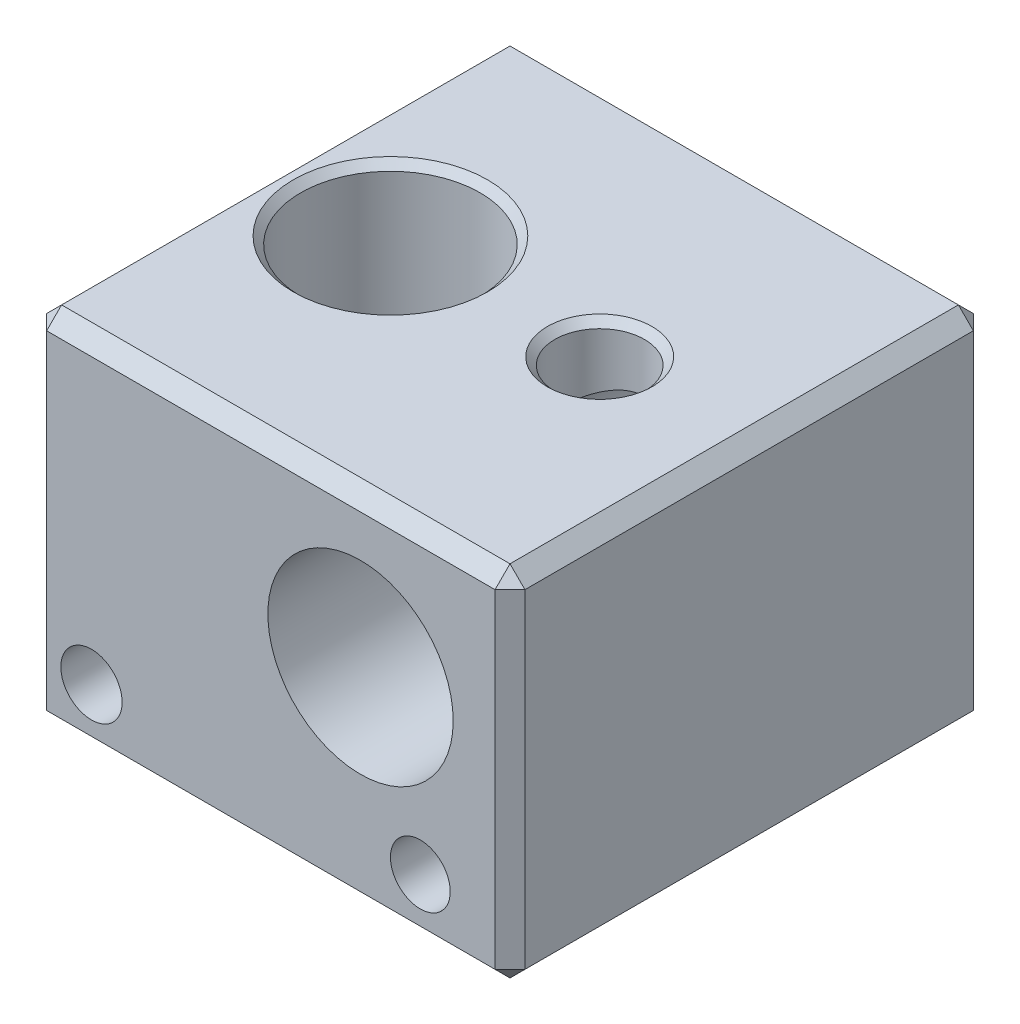
ISO-10303-21;
HEADER;
FILE_DESCRIPTION(('STEP AP214'),'2;1');
FILE_NAME('part.step','',(''),(''),'','','');
FILE_SCHEMA(('AUTOMOTIVE_DESIGN { 1 0 10303 214 1 1 1 1 }'));
ENDSEC;
DATA;
#1=APPLICATION_CONTEXT('core data for automotive mechanical design processes');
#2=APPLICATION_PROTOCOL_DEFINITION('international standard','automotive_design',2000,#1);
#3=PRODUCT_CONTEXT('',#1,'mechanical');
#4=PRODUCT('Part','Part','',(#3));
#5=PRODUCT_RELATED_PRODUCT_CATEGORY('part','',(#4));
#6=PRODUCT_DEFINITION_FORMATION('','',#4);
#7=PRODUCT_DEFINITION_CONTEXT('part definition',#1,'design');
#8=PRODUCT_DEFINITION('design','',#6,#7);
#9=PRODUCT_DEFINITION_SHAPE('','',#8);
#10=(LENGTH_UNIT() NAMED_UNIT(*) SI_UNIT(.MILLI.,.METRE.));
#11=(NAMED_UNIT(*) PLANE_ANGLE_UNIT() SI_UNIT($,.RADIAN.));
#12=(NAMED_UNIT(*) SI_UNIT($,.STERADIAN.) SOLID_ANGLE_UNIT());
#13=UNCERTAINTY_MEASURE_WITH_UNIT(LENGTH_MEASURE(1.E-05),#10,'distance_accuracy_value','');
#14=(GEOMETRIC_REPRESENTATION_CONTEXT(3) GLOBAL_UNCERTAINTY_ASSIGNED_CONTEXT((#13)) GLOBAL_UNIT_ASSIGNED_CONTEXT((#10,
#11,#12)) REPRESENTATION_CONTEXT('',''));
#15=CARTESIAN_POINT('',(0.,0.,0.));
#16=DIRECTION('',(0.,0.,1.));
#17=DIRECTION('',(1.,0.,0.));
#18=AXIS2_PLACEMENT_3D('',#15,#16,#17);
#19=CARTESIAN_POINT('',(8.,6.,0.));
#20=DIRECTION('',(1.,0.,0.));
#21=DIRECTION('',(0.,0.,-1.));
#22=AXIS2_PLACEMENT_3D('',#19,#20,#21);
#23=PLANE('',#22);
#24=DIRECTION('',(0.,0.,-1.));
#25=VECTOR('',#24,1.);
#26=CARTESIAN_POINT('',(8.,-5.5,-8.));
#27=LINE('',#26,#25);
#28=CARTESIAN_POINT('',(8.,-5.5,7.5));
#29=VERTEX_POINT('',#28);
#30=CARTESIAN_POINT('',(8.,-5.5,-7.5));
#31=VERTEX_POINT('',#30);
#32=EDGE_CURVE('E369',#29,#31,#27,.T.);
#33=ORIENTED_EDGE('',*,*,#32,.T.);
#34=DIRECTION('',(0.,1.,0.));
#35=VECTOR('',#34,1.);
#36=CARTESIAN_POINT('',(8.,6.,-7.5));
#37=LINE('',#36,#35);
#38=CARTESIAN_POINT('',(8.,5.5,-7.5));
#39=VERTEX_POINT('',#38);
#40=EDGE_CURVE('E367',#31,#39,#37,.T.);
#41=ORIENTED_EDGE('',*,*,#40,.T.);
#42=DIRECTION('',(0.,0.,1.));
#43=VECTOR('',#42,1.);
#44=CARTESIAN_POINT('',(8.,5.5,0.));
#45=LINE('',#44,#43);
#46=CARTESIAN_POINT('',(8.,5.5,7.5));
#47=VERTEX_POINT('',#46);
#48=EDGE_CURVE('E371',#39,#47,#45,.T.);
#49=ORIENTED_EDGE('',*,*,#48,.T.);
#50=DIRECTION('',(0.,-1.,0.));
#51=VECTOR('',#50,1.);
#52=CARTESIAN_POINT('',(8.,-6.,7.5));
#53=LINE('',#52,#51);
#54=EDGE_CURVE('E373',#47,#29,#53,.T.);
#55=ORIENTED_EDGE('',*,*,#54,.T.);
#56=EDGE_LOOP('',(#33,#41,#49,#55));
#57=FACE_BOUND('',#56,.T.);
#58=ADVANCED_FACE('F34',(#57),#23,.T.);
#59=CARTESIAN_POINT('',(0.,6.,-8.));
#60=DIRECTION('',(0.,0.,-1.));
#61=DIRECTION('',(-1.,0.,0.));
#62=AXIS2_PLACEMENT_3D('',#59,#60,#61);
#63=PLANE('',#62);
#64=DIRECTION('',(0.,-1.,0.));
#65=VECTOR('',#64,1.);
#66=CARTESIAN_POINT('',(7.5,6.,-8.));
#67=LINE('',#66,#65);
#68=CARTESIAN_POINT('',(7.5,5.5,-8.));
#69=VERTEX_POINT('',#68);
#70=CARTESIAN_POINT('',(7.5,-5.5,-8.));
#71=VERTEX_POINT('',#70);
#72=EDGE_CURVE('E396',#69,#71,#67,.T.);
#73=ORIENTED_EDGE('',*,*,#72,.T.);
#74=DIRECTION('',(-1.,0.,0.));
#75=VECTOR('',#74,1.);
#76=CARTESIAN_POINT('',(-8.,-5.5,-8.));
#77=LINE('',#76,#75);
#78=CARTESIAN_POINT('',(-7.5,-5.5,-8.));
#79=VERTEX_POINT('',#78);
#80=EDGE_CURVE('E393',#71,#79,#77,.T.);
#81=ORIENTED_EDGE('',*,*,#80,.T.);
#82=DIRECTION('',(0.,1.,0.));
#83=VECTOR('',#82,1.);
#84=CARTESIAN_POINT('',(-7.5,6.,-8.));
#85=LINE('',#84,#83);
#86=CARTESIAN_POINT('',(-7.5,5.5,-8.));
#87=VERTEX_POINT('',#86);
#88=EDGE_CURVE('E400',#79,#87,#85,.T.);
#89=ORIENTED_EDGE('',*,*,#88,.T.);
#90=DIRECTION('',(1.,0.,0.));
#91=VECTOR('',#90,1.);
#92=CARTESIAN_POINT('',(0.,5.5,-8.));
#93=LINE('',#92,#91);
#94=EDGE_CURVE('E398',#87,#69,#93,.T.);
#95=ORIENTED_EDGE('',*,*,#94,.T.);
#96=EDGE_LOOP('',(#73,#81,#89,#95));
#97=FACE_BOUND('',#96,.T.);
#98=CARTESIAN_POINT('',(5.,-4.,-8.));
#99=DIRECTION('',(0.,0.,1.));
#100=DIRECTION('',(1.,0.,0.));
#101=AXIS2_PLACEMENT_3D('',#98,#99,#100);
#102=CIRCLE('',#101,1.);
#103=CARTESIAN_POINT('',(6.,-4.,-8.));
#104=VERTEX_POINT('',#103);
#105=EDGE_CURVE('E681',#104,#104,#102,.T.);
#106=ORIENTED_EDGE('',*,*,#105,.T.);
#107=EDGE_LOOP('',(#106));
#108=FACE_BOUND('',#107,.T.);
#109=CARTESIAN_POINT('',(3.,1.,-8.));
#110=DIRECTION('',(0.,0.,1.));
#111=DIRECTION('',(1.,0.,0.));
#112=AXIS2_PLACEMENT_3D('',#109,#110,#111);
#113=CIRCLE('',#112,3.1);
#114=CARTESIAN_POINT('',(6.1,1.,-8.));
#115=VERTEX_POINT('',#114);
#116=EDGE_CURVE('E143',#115,#115,#113,.T.);
#117=ORIENTED_EDGE('',*,*,#116,.T.);
#118=EDGE_LOOP('',(#117));
#119=FACE_BOUND('',#118,.T.);
#120=ADVANCED_FACE('F175',(#97,#108,#119),#63,.T.);
#121=CARTESIAN_POINT('',(-8.,6.,0.));
#122=DIRECTION('',(1.,0.,0.));
#123=DIRECTION('',(0.,0.,-1.));
#124=AXIS2_PLACEMENT_3D('',#121,#122,#123);
#125=PLANE('',#124);
#126=DIRECTION('',(0.,-1.,0.));
#127=VECTOR('',#126,1.);
#128=CARTESIAN_POINT('',(-8.,-6.,-7.5));
#129=LINE('',#128,#127);
#130=CARTESIAN_POINT('',(-8.,5.5,-7.5));
#131=VERTEX_POINT('',#130);
#132=CARTESIAN_POINT('',(-8.,-5.5,-7.5));
#133=VERTEX_POINT('',#132);
#134=EDGE_CURVE('E387',#131,#133,#129,.T.);
#135=ORIENTED_EDGE('',*,*,#134,.T.);
#136=DIRECTION('',(0.,0.,1.));
#137=VECTOR('',#136,1.);
#138=CARTESIAN_POINT('',(-8.,-5.5,0.));
#139=LINE('',#138,#137);
#140=CARTESIAN_POINT('',(-8.,-5.5,7.5));
#141=VERTEX_POINT('',#140);
#142=EDGE_CURVE('E384',#133,#141,#139,.T.);
#143=ORIENTED_EDGE('',*,*,#142,.T.);
#144=DIRECTION('',(0.,1.,0.));
#145=VECTOR('',#144,1.);
#146=CARTESIAN_POINT('',(-8.,6.,7.5));
#147=LINE('',#146,#145);
#148=CARTESIAN_POINT('',(-8.,5.5,7.5));
#149=VERTEX_POINT('',#148);
#150=EDGE_CURVE('E391',#141,#149,#147,.T.);
#151=ORIENTED_EDGE('',*,*,#150,.T.);
#152=DIRECTION('',(0.,0.,-1.));
#153=VECTOR('',#152,1.);
#154=CARTESIAN_POINT('',(-8.,5.5,-8.));
#155=LINE('',#154,#153);
#156=EDGE_CURVE('E389',#149,#131,#155,.T.);
#157=ORIENTED_EDGE('',*,*,#156,.T.);
#158=EDGE_LOOP('',(#135,#143,#151,#157));
#159=FACE_BOUND('',#158,.T.);
#160=ADVANCED_FACE('F181',(#159),#125,.F.);
#161=CARTESIAN_POINT('',(-4.,6.,0.));
#162=DIRECTION('',(0.,-1.,0.));
#163=DIRECTION('',(0.,0.,-1.));
#164=AXIS2_PLACEMENT_3D('',#161,#162,#163);
#165=CYLINDRICAL_SURFACE('',#164,3.);
#166=CARTESIAN_POINT('',(-4.,-5.75,0.));
#167=DIRECTION('',(0.,1.,0.));
#168=DIRECTION('',(0.,0.,1.));
#169=AXIS2_PLACEMENT_3D('',#166,#167,#168);
#170=CIRCLE('',#169,3.);
#171=CARTESIAN_POINT('',(-4.,-5.75,3.));
#172=VERTEX_POINT('',#171);
#173=EDGE_CURVE('E285',#172,#172,#170,.F.);
#174=ORIENTED_EDGE('',*,*,#173,.T.);
#175=EDGE_LOOP('',(#174));
#176=FACE_BOUND('',#175,.T.);
#177=CARTESIAN_POINT('',(-4.,5.74999999999999,0.));
#178=DIRECTION('',(0.,1.,0.));
#179=DIRECTION('',(0.,0.,1.));
#180=AXIS2_PLACEMENT_3D('',#177,#178,#179);
#181=CIRCLE('',#180,3.);
#182=CARTESIAN_POINT('',(-4.,5.74999999999999,3.));
#183=VERTEX_POINT('',#182);
#184=EDGE_CURVE('E289',#183,#183,#181,.T.);
#185=ORIENTED_EDGE('',*,*,#184,.T.);
#186=EDGE_LOOP('',(#185));
#187=FACE_BOUND('',#186,.T.);
#188=ADVANCED_FACE('F187',(#176,#187),#165,.F.);
#189=CARTESIAN_POINT('',(0.,6.,8.));
#190=DIRECTION('',(0.,0.,-1.));
#191=DIRECTION('',(-1.,0.,0.));
#192=AXIS2_PLACEMENT_3D('',#189,#190,#191);
#193=PLANE('',#192);
#194=DIRECTION('',(0.,-1.,0.));
#195=VECTOR('',#194,1.);
#196=CARTESIAN_POINT('',(-7.5,6.,8.));
#197=LINE('',#196,#195);
#198=CARTESIAN_POINT('',(-7.5,5.5,8.));
#199=VERTEX_POINT('',#198);
#200=CARTESIAN_POINT('',(-7.5,-5.5,8.));
#201=VERTEX_POINT('',#200);
#202=EDGE_CURVE('E382',#199,#201,#197,.T.);
#203=ORIENTED_EDGE('',*,*,#202,.T.);
#204=DIRECTION('',(1.,0.,0.));
#205=VECTOR('',#204,1.);
#206=CARTESIAN_POINT('',(0.,-5.5,8.));
#207=LINE('',#206,#205);
#208=CARTESIAN_POINT('',(7.5,-5.5,8.));
#209=VERTEX_POINT('',#208);
#210=EDGE_CURVE('E375',#201,#209,#207,.T.);
#211=ORIENTED_EDGE('',*,*,#210,.T.);
#212=DIRECTION('',(0.,1.,0.));
#213=VECTOR('',#212,1.);
#214=CARTESIAN_POINT('',(7.5,6.,8.));
#215=LINE('',#214,#213);
#216=CARTESIAN_POINT('',(7.5,5.5,8.));
#217=VERTEX_POINT('',#216);
#218=EDGE_CURVE('E378',#209,#217,#215,.T.);
#219=ORIENTED_EDGE('',*,*,#218,.T.);
#220=DIRECTION('',(-1.,0.,0.));
#221=VECTOR('',#220,1.);
#222=CARTESIAN_POINT('',(-8.,5.5,8.));
#223=LINE('',#222,#221);
#224=EDGE_CURVE('E380',#217,#199,#223,.T.);
#225=ORIENTED_EDGE('',*,*,#224,.T.);
#226=EDGE_LOOP('',(#203,#211,#219,#225));
#227=FACE_BOUND('',#226,.T.);
#228=CARTESIAN_POINT('',(5.,-4.,8.));
#229=DIRECTION('',(0.,0.,1.));
#230=DIRECTION('',(1.,0.,0.));
#231=AXIS2_PLACEMENT_3D('',#228,#229,#230);
#232=CIRCLE('',#231,1.);
#233=CARTESIAN_POINT('',(6.,-4.,8.));
#234=VERTEX_POINT('',#233);
#235=EDGE_CURVE('E153',#234,#234,#232,.T.);
#236=ORIENTED_EDGE('',*,*,#235,.F.);
#237=EDGE_LOOP('',(#236));
#238=FACE_BOUND('',#237,.T.);
#239=CARTESIAN_POINT('',(3.,1.,8.));
#240=DIRECTION('',(0.,0.,1.));
#241=DIRECTION('',(1.,0.,0.));
#242=AXIS2_PLACEMENT_3D('',#239,#240,#241);
#243=CIRCLE('',#242,3.1);
#244=CARTESIAN_POINT('',(6.1,1.,8.));
#245=VERTEX_POINT('',#244);
#246=EDGE_CURVE('E685',#245,#245,#243,.T.);
#247=ORIENTED_EDGE('',*,*,#246,.F.);
#248=EDGE_LOOP('',(#247));
#249=FACE_BOUND('',#248,.T.);
#250=CARTESIAN_POINT('',(-6.,-4.,8.));
#251=DIRECTION('',(0.,0.,1.));
#252=DIRECTION('',(1.,0.,0.));
#253=AXIS2_PLACEMENT_3D('',#250,#251,#252);
#254=CIRCLE('',#253,1.025);
#255=CARTESIAN_POINT('',(-4.975,-4.,8.));
#256=VERTEX_POINT('',#255);
#257=EDGE_CURVE('E138',#256,#256,#254,.T.);
#258=ORIENTED_EDGE('',*,*,#257,.F.);
#259=EDGE_LOOP('',(#258));
#260=FACE_BOUND('',#259,.T.);
#261=ADVANCED_FACE('F190',(#227,#238,#249,#260),#193,.F.);
#262=CARTESIAN_POINT('',(0.,6.,0.));
#263=DIRECTION('',(0.,1.,0.));
#264=DIRECTION('',(0.,0.,1.));
#265=AXIS2_PLACEMENT_3D('',#262,#263,#264);
#266=PLANE('',#265);
#267=CARTESIAN_POINT('',(3.,6.,0.));
#268=DIRECTION('',(0.,1.,0.));
#269=DIRECTION('',(0.,0.,1.));
#270=AXIS2_PLACEMENT_3D('',#267,#268,#269);
#271=CIRCLE('',#270,1.75000000000001);
#272=CARTESIAN_POINT('',(3.,6.,1.75000000000001));
#273=VERTEX_POINT('',#272);
#274=EDGE_CURVE('E11',#273,#273,#271,.F.);
#275=ORIENTED_EDGE('',*,*,#274,.T.);
#276=EDGE_LOOP('',(#275));
#277=FACE_BOUND('',#276,.T.);
#278=CARTESIAN_POINT('',(-4.,6.,0.));
#279=DIRECTION('',(0.,1.,0.));
#280=DIRECTION('',(0.,0.,1.));
#281=AXIS2_PLACEMENT_3D('',#278,#279,#280);
#282=CIRCLE('',#281,3.25000000000001);
#283=CARTESIAN_POINT('',(-4.,6.,3.25000000000001));
#284=VERTEX_POINT('',#283);
#285=EDGE_CURVE('E42',#284,#284,#282,.F.);
#286=ORIENTED_EDGE('',*,*,#285,.T.);
#287=EDGE_LOOP('',(#286));
#288=FACE_BOUND('',#287,.T.);
#289=DIRECTION('',(1.,0.,0.));
#290=VECTOR('',#289,1.);
#291=CARTESIAN_POINT('',(8.,6.,7.5));
#292=LINE('',#291,#290);
#293=CARTESIAN_POINT('',(-7.5,6.,7.5));
#294=VERTEX_POINT('',#293);
#295=CARTESIAN_POINT('',(7.5,6.,7.5));
#296=VERTEX_POINT('',#295);
#297=EDGE_CURVE('E57',#294,#296,#292,.T.);
#298=ORIENTED_EDGE('',*,*,#297,.T.);
#299=DIRECTION('',(0.,0.,-1.));
#300=VECTOR('',#299,1.);
#301=CARTESIAN_POINT('',(7.5,6.,0.));
#302=LINE('',#301,#300);
#303=CARTESIAN_POINT('',(7.5,6.,-7.5));
#304=VERTEX_POINT('',#303);
#305=EDGE_CURVE('E297',#296,#304,#302,.T.);
#306=ORIENTED_EDGE('',*,*,#305,.T.);
#307=DIRECTION('',(-1.,0.,0.));
#308=VECTOR('',#307,1.);
#309=CARTESIAN_POINT('',(0.,6.,-7.5));
#310=LINE('',#309,#308);
#311=CARTESIAN_POINT('',(-7.5,6.,-7.5));
#312=VERTEX_POINT('',#311);
#313=EDGE_CURVE('E362',#304,#312,#310,.T.);
#314=ORIENTED_EDGE('',*,*,#313,.T.);
#315=DIRECTION('',(0.,0.,1.));
#316=VECTOR('',#315,1.);
#317=CARTESIAN_POINT('',(-7.5,6.,8.));
#318=LINE('',#317,#316);
#319=EDGE_CURVE('E365',#312,#294,#318,.T.);
#320=ORIENTED_EDGE('',*,*,#319,.T.);
#321=EDGE_LOOP('',(#298,#306,#314,#320));
#322=FACE_BOUND('',#321,.T.);
#323=ADVANCED_FACE('F454',(#277,#288,#322),#266,.T.);
#324=CARTESIAN_POINT('',(0.,-6.,0.));
#325=DIRECTION('',(0.,1.,0.));
#326=DIRECTION('',(0.,0.,1.));
#327=AXIS2_PLACEMENT_3D('',#324,#325,#326);
#328=PLANE('',#327);
#329=CARTESIAN_POINT('',(-4.,-6.,0.));
#330=DIRECTION('',(0.,1.,0.));
#331=DIRECTION('',(0.,0.,1.));
#332=AXIS2_PLACEMENT_3D('',#329,#330,#331);
#333=CIRCLE('',#332,3.25);
#334=CARTESIAN_POINT('',(-4.,-6.,3.25));
#335=VERTEX_POINT('',#334);
#336=EDGE_CURVE('E294',#335,#335,#333,.T.);
#337=ORIENTED_EDGE('',*,*,#336,.T.);
#338=EDGE_LOOP('',(#337));
#339=FACE_BOUND('',#338,.T.);
#340=DIRECTION('',(0.,0.,-1.));
#341=VECTOR('',#340,1.);
#342=CARTESIAN_POINT('',(-7.5,-6.,0.));
#343=LINE('',#342,#341);
#344=CARTESIAN_POINT('',(-7.5,-6.,7.5));
#345=VERTEX_POINT('',#344);
#346=CARTESIAN_POINT('',(-7.5,-6.,-7.5));
#347=VERTEX_POINT('',#346);
#348=EDGE_CURVE('E405',#345,#347,#343,.T.);
#349=ORIENTED_EDGE('',*,*,#348,.T.);
#350=DIRECTION('',(1.,0.,0.));
#351=VECTOR('',#350,1.);
#352=CARTESIAN_POINT('',(8.,-6.,-7.5));
#353=LINE('',#352,#351);
#354=CARTESIAN_POINT('',(7.5,-6.,-7.5));
#355=VERTEX_POINT('',#354);
#356=EDGE_CURVE('E402',#347,#355,#353,.T.);
#357=ORIENTED_EDGE('',*,*,#356,.T.);
#358=DIRECTION('',(0.,0.,1.));
#359=VECTOR('',#358,1.);
#360=CARTESIAN_POINT('',(7.5,-6.,8.));
#361=LINE('',#360,#359);
#362=CARTESIAN_POINT('',(7.5,-6.,7.5));
#363=VERTEX_POINT('',#362);
#364=EDGE_CURVE('E137',#355,#363,#361,.T.);
#365=ORIENTED_EDGE('',*,*,#364,.T.);
#366=DIRECTION('',(-1.,0.,0.));
#367=VECTOR('',#366,1.);
#368=CARTESIAN_POINT('',(0.,-6.,7.5));
#369=LINE('',#368,#367);
#370=EDGE_CURVE('E140',#363,#345,#369,.T.);
#371=ORIENTED_EDGE('',*,*,#370,.T.);
#372=EDGE_LOOP('',(#349,#357,#365,#371));
#373=FACE_BOUND('',#372,.T.);
#374=ADVANCED_FACE('F131',(#339,#373),#328,.F.);
#375=CARTESIAN_POINT('',(-6.,-4.,3.5));
#376=DIRECTION('',(0.,0.,1.));
#377=DIRECTION('',(1.,0.,0.));
#378=AXIS2_PLACEMENT_3D('',#375,#376,#377);
#379=CONICAL_SURFACE('',#378,1.025,1.02974425867665);
#380=CARTESIAN_POINT('',(-6.,-4.,2.88411786549675));
#381=VERTEX_POINT('',#380);
#382=VERTEX_LOOP('',#381);
#383=FACE_BOUND('',#382,.T.);
#384=CARTESIAN_POINT('',(-6.,-4.,3.5));
#385=DIRECTION('',(0.,0.,1.));
#386=DIRECTION('',(1.,0.,0.));
#387=AXIS2_PLACEMENT_3D('',#384,#385,#386);
#388=CIRCLE('',#387,1.025);
#389=CARTESIAN_POINT('',(-4.975,-4.,3.5));
#390=VERTEX_POINT('',#389);
#391=EDGE_CURVE('E135',#390,#390,#388,.T.);
#392=ORIENTED_EDGE('',*,*,#391,.T.);
#393=EDGE_LOOP('',(#392));
#394=FACE_BOUND('',#393,.T.);
#395=ADVANCED_FACE('F127',(#383,#394),#379,.F.);
#396=CARTESIAN_POINT('',(-6.,-4.,8.));
#397=DIRECTION('',(0.,0.,1.));
#398=DIRECTION('',(1.,0.,0.));
#399=AXIS2_PLACEMENT_3D('',#396,#397,#398);
#400=CYLINDRICAL_SURFACE('',#399,1.025);
#401=ORIENTED_EDGE('',*,*,#391,.F.);
#402=EDGE_LOOP('',(#401));
#403=FACE_BOUND('',#402,.T.);
#404=ORIENTED_EDGE('',*,*,#257,.T.);
#405=EDGE_LOOP('',(#404));
#406=FACE_BOUND('',#405,.T.);
#407=ADVANCED_FACE('F130',(#403,#406),#400,.F.);
#408=CARTESIAN_POINT('',(3.,1.,-8.));
#409=DIRECTION('',(0.,0.,1.));
#410=DIRECTION('',(1.,0.,0.));
#411=AXIS2_PLACEMENT_3D('',#408,#409,#410);
#412=CYLINDRICAL_SURFACE('',#411,3.1);
#413=CARTESIAN_POINT('',(3.,4.1,1.5));
#414=CARTESIAN_POINT('',(3.07915977181462,4.09999597642038,1.49999529296468));
#415=CARTESIAN_POINT('',(3.15842288075809,4.09693497160373,1.49369683955839));
#416=CARTESIAN_POINT('',(3.31462546467892,4.08499234682663,1.46877262837549));
#417=CARTESIAN_POINT('',(3.39155981896931,4.07609875456068,1.4501215140343));
#418=CARTESIAN_POINT('',(3.54060341094592,4.05342584261601,1.40138191522432));
#419=CARTESIAN_POINT('',(3.61272977492893,4.03966510245178,1.37133689401739));
#420=CARTESIAN_POINT('',(3.75082034873863,4.00853554392298,1.30087774159277));
#421=CARTESIAN_POINT('',(3.8167853053403,3.99116716363645,1.26046486920983));
#422=CARTESIAN_POINT('',(3.94496533625193,3.95326290002702,1.16775554958169));
#423=CARTESIAN_POINT('',(4.00674424015157,3.93260205714617,1.11490784824096));
#424=CARTESIAN_POINT('',(4.12095918636624,3.890874407927,1.00001014953006));
#425=CARTESIAN_POINT('',(4.17338859126746,3.86980732485464,0.937953671458202));
#426=CARTESIAN_POINT('',(4.27116086028914,3.82792833782551,0.8010722476601));
#427=CARTESIAN_POINT('',(4.31573021820139,3.80724210749,0.725651929346729));
#428=CARTESIAN_POINT('',(4.39136353669037,3.77053911674571,0.567268570731539));
#429=CARTESIAN_POINT('',(4.42243666689194,3.75451918839689,0.484310698087358));
#430=CARTESIAN_POINT('',(4.46825331672929,3.73036118668724,0.318147108146287));
#431=CARTESIAN_POINT('',(4.48384017116723,3.721819502993,0.23523541625442));
#432=CARTESIAN_POINT('',(4.50083891652223,3.71248732714977,0.0675694189226937));
#433=CARTESIAN_POINT('',(4.50226328587823,3.71169001152166,-0.0171831984852869));
#434=CARTESIAN_POINT('',(4.49151791991513,3.71760810460528,-0.176097490071581));
#435=CARTESIAN_POINT('',(4.48082916653394,3.72350517814873,-0.250396919578849));
#436=CARTESIAN_POINT('',(4.44871001883635,3.7407239691475,-0.395977710690246));
#437=CARTESIAN_POINT('',(4.4272765472017,3.75204724064055,-0.467258201315278));
#438=CARTESIAN_POINT('',(4.37386819698877,3.77909986285486,-0.606795469604337));
#439=CARTESIAN_POINT('',(4.34165938165877,3.79492571085596,-0.674943125225589));
#440=CARTESIAN_POINT('',(4.26778986270146,3.82919863337539,-0.805183438946943));
#441=CARTESIAN_POINT('',(4.2261249505331,3.84764687364832,-0.867273383348186));
#442=CARTESIAN_POINT('',(4.12879722643253,3.88771489454708,-0.991333088786456));
#443=CARTESIAN_POINT('',(4.0720638451715,3.90945233713627,-1.05242780585103));
#444=CARTESIAN_POINT('',(3.94903700373154,3.95187442060876,-1.16458625824764));
#445=CARTESIAN_POINT('',(3.88273953658797,3.97255861528501,-1.21564576794678));
#446=CARTESIAN_POINT('',(3.73900734209544,4.01158253300309,-1.30822988474855));
#447=CARTESIAN_POINT('',(3.66122781797247,4.02979163503844,-1.34927865517565));
#448=CARTESIAN_POINT('',(3.49876114199507,4.06072768963243,-1.41738461203208));
#449=CARTESIAN_POINT('',(3.41407919768172,4.07345873041227,-1.44445223548274));
#450=CARTESIAN_POINT('',(3.2474068560528,4.09115669145021,-1.48172025888453));
#451=CARTESIAN_POINT('',(3.16573443615837,4.09665865598145,-1.49308672062882));
#452=CARTESIAN_POINT('',(3.00146762178004,4.10108637596971,-1.50225023509642));
#453=CARTESIAN_POINT('',(2.91887363918456,4.10001496041855,-1.50005312518445));
#454=CARTESIAN_POINT('',(2.76137885944981,4.09173711541004,-1.48286405136195));
#455=CARTESIAN_POINT('',(2.68635038714927,4.08497504037063,-1.46879861778274));
#456=CARTESIAN_POINT('',(2.53985552059721,4.0665485679608,-1.42969111021901));
#457=CARTESIAN_POINT('',(2.468389531672,4.05488361417641,-1.40464779037107));
#458=CARTESIAN_POINT('',(2.32860070585063,4.02728476011027,-1.34358303927532));
#459=CARTESIAN_POINT('',(2.26043482976315,4.01123408615672,-1.30725691739171));
#460=CARTESIAN_POINT('',(2.13093151328423,3.97644474324639,-1.22499460309151));
#461=CARTESIAN_POINT('',(2.06959706399895,3.9577049050061,-1.17905422626836));
#462=CARTESIAN_POINT('',(1.94944170578362,3.91731206279293,-1.07390895792714));
#463=CARTESIAN_POINT('',(1.89138869103721,3.89555036660016,-1.01386657095023));
#464=CARTESIAN_POINT('',(1.78586139592846,3.85291315524895,-0.884773164890674));
#465=CARTESIAN_POINT('',(1.73839329578026,3.83203816353815,-0.815716919992923));
#466=CARTESIAN_POINT('',(1.65361920140516,3.79276450107802,-0.666987428868441));
#467=CARTESIAN_POINT('',(1.61679988699864,3.774499545128,-0.58699845137175));
#468=CARTESIAN_POINT('',(1.55753664260151,3.74416205958639,-0.420784263722467));
#469=CARTESIAN_POINT('',(1.53507541318362,3.73208208149401,-0.33456669812492));
#470=CARTESIAN_POINT('',(1.50713753689094,3.71690845900092,-0.166995806053239));
#471=CARTESIAN_POINT('',(1.50026841836273,3.71307979083778,-0.085942091506686));
#472=CARTESIAN_POINT('',(1.49974737267378,3.71279292639793,0.0762081044812507));
#473=CARTESIAN_POINT('',(1.50609081466772,3.71633214776335,0.157304560982426));
#474=CARTESIAN_POINT('',(1.53053493223183,3.72962202886765,0.310089299737686));
#475=CARTESIAN_POINT('',(1.54760389225735,3.73882630078165,0.381995866001077));
#476=CARTESIAN_POINT('',(1.59179669036143,3.76180738740559,0.521868601326146));
#477=CARTESIAN_POINT('',(1.61892362498772,3.77558561016049,0.589833549422497));
#478=CARTESIAN_POINT('',(1.68451657692935,3.80729627577953,0.724924730665312));
#479=CARTESIAN_POINT('',(1.72362146141282,3.82544547690661,0.791688484200769));
#480=CARTESIAN_POINT('',(1.81131972600155,3.86344589570492,0.918131698139951));
#481=CARTESIAN_POINT('',(1.85991783215684,3.8832979583464,0.977807606079314));
#482=CARTESIAN_POINT('',(1.97156375078651,3.92510681717823,1.09525774071261));
#483=CARTESIAN_POINT('',(2.03561672298499,3.9470526292076,1.15208553285705));
#484=CARTESIAN_POINT('',(2.17301649075045,3.98851853466426,1.25436518012467));
#485=CARTESIAN_POINT('',(2.24636793220146,4.00803740577162,1.29981131450963));
#486=CARTESIAN_POINT('',(2.40069933116372,4.04254711231385,1.37779452138669));
#487=CARTESIAN_POINT('',(2.48168317941652,4.05753562176688,1.4103249653733));
#488=CARTESIAN_POINT('',(2.64879510265626,4.08118837139856,1.46089989511797));
#489=CARTESIAN_POINT('',(2.73490741027468,4.08987101250737,1.47898654430786));
#490=CARTESIAN_POINT('',(2.85151084784554,4.09658457518121,1.49293017778456));
#491=CARTESIAN_POINT('',(2.88112725022003,4.09786242664077,1.49557806913413));
#492=CARTESIAN_POINT('',(2.94049089712636,4.09957090617031,1.49911388741648));
#493=CARTESIAN_POINT('',(2.97023814495743,4.10000151275314,1.50000176971332));
#494=CARTESIAN_POINT('',(3.,4.1,1.5));
#495=B_SPLINE_CURVE_WITH_KNOTS('',3,(#413,#414,#415,#416,#417,#418,#419,#420,#421,#422,#423,
#424,#425,#426,#427,#428,#429,#430,#431,#432,#433,#434,#435,#436,#437,#438,#439,#440,#441,#442,
#443,#444,#445,#446,#447,#448,#449,#450,#451,#452,#453,#454,#455,#456,#457,#458,#459,#460,#461,
#462,#463,#464,#465,#466,#467,#468,#469,#470,#471,#472,#473,#474,#475,#476,#477,#478,#479,#480,
#481,#482,#483,#484,#485,#486,#487,#488,#489,#490,#491,#492,#493,#494),.UNSPECIFIED.,.T.,.F.,(4,
2,2,2,2,2,2,2,2,2,2,2,2,2,2,2,2,2,2,2,2,2,2,2,2,2,2,2,2,2,2,2,2,2,2,2,2,2,2,2,4),(0.,
0.237358149391479,0.475205045204216,0.712153629381457,0.949073457545626,1.19966743221417,
1.45043860686557,1.71911904496211,1.98761664919517,2.24052562014625,2.49321173549778,
2.71804786039364,2.94294841582364,3.17308816404913,3.40333054008843,3.66068413428495,
3.91814586404605,4.18614615771728,4.45394609714843,4.70053706585277,4.94702191641386,
5.17587433638078,5.40475273518385,5.64044645973029,5.87624297925293,6.13403038031834,
6.39196790389034,6.66030131434513,6.92831080921333,7.17124517031379,7.41409440013794,
7.63655663166079,7.85908740955728,8.09655437634792,8.33413986498565,8.59809861420732,
8.86218977137576,9.12641628901263,9.38986864430433,9.47910639124577,9.56834640133454),.UNSPECIFIED.);
#496=CARTESIAN_POINT('',(3.,4.1,1.5));
#497=VERTEX_POINT('',#496);
#498=EDGE_CURVE('E147',#497,#497,#495,.T.);
#499=ORIENTED_EDGE('',*,*,#498,.T.);
#500=EDGE_LOOP('',(#499));
#501=FACE_BOUND('',#500,.T.);
#502=ORIENTED_EDGE('',*,*,#116,.F.);
#503=EDGE_LOOP('',(#502));
#504=FACE_BOUND('',#503,.T.);
#505=ORIENTED_EDGE('',*,*,#246,.T.);
#506=EDGE_LOOP('',(#505));
#507=FACE_BOUND('',#506,.T.);
#508=ADVANCED_FACE('F156',(#501,#504,#507),#412,.F.);
#509=CARTESIAN_POINT('',(5.,-4.,-8.));
#510=DIRECTION('',(0.,0.,1.));
#511=DIRECTION('',(1.,0.,0.));
#512=AXIS2_PLACEMENT_3D('',#509,#510,#511);
#513=CYLINDRICAL_SURFACE('',#512,1.);
#514=ORIENTED_EDGE('',*,*,#105,.F.);
#515=EDGE_LOOP('',(#514));
#516=FACE_BOUND('',#515,.T.);
#517=ORIENTED_EDGE('',*,*,#235,.T.);
#518=EDGE_LOOP('',(#517));
#519=FACE_BOUND('',#518,.T.);
#520=ADVANCED_FACE('F164',(#516,#519),#513,.F.);
#521=CARTESIAN_POINT('',(3.,0.,0.));
#522=DIRECTION('',(0.,1.,0.));
#523=DIRECTION('',(0.,0.,1.));
#524=AXIS2_PLACEMENT_3D('',#521,#522,#523);
#525=CYLINDRICAL_SURFACE('',#524,1.5);
#526=CARTESIAN_POINT('',(3.,5.75,0.));
#527=DIRECTION('',(0.,1.,0.));
#528=DIRECTION('',(0.,0.,1.));
#529=AXIS2_PLACEMENT_3D('',#526,#527,#528);
#530=CIRCLE('',#529,1.5);
#531=CARTESIAN_POINT('',(3.,5.75,1.5));
#532=VERTEX_POINT('',#531);
#533=EDGE_CURVE('E284',#532,#532,#530,.T.);
#534=ORIENTED_EDGE('',*,*,#533,.T.);
#535=EDGE_LOOP('',(#534));
#536=FACE_BOUND('',#535,.T.);
#537=ORIENTED_EDGE('',*,*,#498,.F.);
#538=EDGE_LOOP('',(#537));
#539=FACE_BOUND('',#538,.T.);
#540=ADVANCED_FACE('F160',(#536,#539),#525,.F.);
#541=CARTESIAN_POINT('',(0.,6.,7.5));
#542=DIRECTION('',(0.,0.70710678118655,0.707106781186545));
#543=DIRECTION('',(-1.,0.,0.));
#544=AXIS2_PLACEMENT_3D('',#541,#542,#543);
#545=PLANE('',#544);
#546=DIRECTION('',(0.,0.707106781186545,-0.70710678118655));
#547=VECTOR('',#546,1.);
#548=CARTESIAN_POINT('',(-7.5,5.5,8.));
#549=LINE('',#548,#547);
#550=EDGE_CURVE('E154',#199,#294,#549,.T.);
#551=ORIENTED_EDGE('',*,*,#550,.F.);
#552=ORIENTED_EDGE('',*,*,#224,.F.);
#553=DIRECTION('',(0.,-0.707106781186545,0.70710678118655));
#554=VECTOR('',#553,1.);
#555=CARTESIAN_POINT('',(7.5,5.75,7.75));
#556=LINE('',#555,#554);
#557=EDGE_CURVE('E300',#296,#217,#556,.T.);
#558=ORIENTED_EDGE('',*,*,#557,.F.);
#559=ORIENTED_EDGE('',*,*,#297,.F.);
#560=EDGE_LOOP('',(#551,#552,#558,#559));
#561=FACE_BOUND('',#560,.T.);
#562=ADVANCED_FACE('F163',(#561),#545,.T.);
#563=CARTESIAN_POINT('',(-7.5,5.5,8.));
#564=DIRECTION('',(-0.57735026918963,0.577350269189626,0.577350269189622));
#565=DIRECTION('',(-0.707106781186545,-0.70710678118655,0.));
#566=AXIS2_PLACEMENT_3D('',#563,#564,#565);
#567=PLANE('',#566);
#568=DIRECTION('',(-0.707106781186545,0.,-0.70710678118655));
#569=VECTOR('',#568,1.);
#570=CARTESIAN_POINT('',(-7.5,5.5,8.));
#571=LINE('',#570,#569);
#572=EDGE_CURVE('E306',#199,#149,#571,.T.);
#573=ORIENTED_EDGE('',*,*,#572,.F.);
#574=ORIENTED_EDGE('',*,*,#550,.T.);
#575=DIRECTION('',(-0.707106781186545,-0.70710678118655,0.));
#576=VECTOR('',#575,1.);
#577=CARTESIAN_POINT('',(-7.75,5.75,7.5));
#578=LINE('',#577,#576);
#579=EDGE_CURVE('E303',#149,#294,#578,.F.);
#580=ORIENTED_EDGE('',*,*,#579,.F.);
#581=EDGE_LOOP('',(#573,#574,#580));
#582=FACE_BOUND('',#581,.T.);
#583=ADVANCED_FACE('F263',(#582),#567,.T.);
#584=CARTESIAN_POINT('',(8.,5.5,7.5));
#585=DIRECTION('',(0.577350269189626,0.57735026918963,0.577350269189622));
#586=DIRECTION('',(-0.70710678118655,0.707106781186545,0.));
#587=AXIS2_PLACEMENT_3D('',#584,#585,#586);
#588=PLANE('',#587);
#589=DIRECTION('',(0.70710678118655,-0.707106781186545,0.));
#590=VECTOR('',#589,1.);
#591=CARTESIAN_POINT('',(8.,5.5,7.5));
#592=LINE('',#591,#590);
#593=EDGE_CURVE('E312',#296,#47,#592,.T.);
#594=ORIENTED_EDGE('',*,*,#593,.F.);
#595=ORIENTED_EDGE('',*,*,#557,.T.);
#596=DIRECTION('',(0.707106781186545,0.,-0.70710678118655));
#597=VECTOR('',#596,1.);
#598=CARTESIAN_POINT('',(8.,5.5,7.5));
#599=LINE('',#598,#597);
#600=EDGE_CURVE('E309',#47,#217,#599,.F.);
#601=ORIENTED_EDGE('',*,*,#600,.F.);
#602=EDGE_LOOP('',(#594,#595,#601));
#603=FACE_BOUND('',#602,.T.);
#604=ADVANCED_FACE('F259',(#603),#588,.T.);
#605=CARTESIAN_POINT('',(-7.5,6.,0.));
#606=DIRECTION('',(-0.70710678118655,0.707106781186545,0.));
#607=DIRECTION('',(0.,0.,-1.));
#608=AXIS2_PLACEMENT_3D('',#605,#606,#607);
#609=PLANE('',#608);
#610=ORIENTED_EDGE('',*,*,#579,.T.);
#611=ORIENTED_EDGE('',*,*,#319,.F.);
#612=DIRECTION('',(0.707106781186545,0.70710678118655,0.));
#613=VECTOR('',#612,1.);
#614=CARTESIAN_POINT('',(-7.5,6.,-7.5));
#615=LINE('',#614,#613);
#616=EDGE_CURVE('E318',#131,#312,#615,.T.);
#617=ORIENTED_EDGE('',*,*,#616,.F.);
#618=ORIENTED_EDGE('',*,*,#156,.F.);
#619=EDGE_LOOP('',(#610,#611,#617,#618));
#620=FACE_BOUND('',#619,.T.);
#621=ADVANCED_FACE('F255',(#620),#609,.T.);
#622=CARTESIAN_POINT('',(-7.5,6.,8.));
#623=DIRECTION('',(0.70710678118655,0.,-0.707106781186545));
#624=DIRECTION('',(0.,-1.,0.));
#625=AXIS2_PLACEMENT_3D('',#622,#623,#624);
#626=PLANE('',#625);
#627=ORIENTED_EDGE('',*,*,#572,.T.);
#628=ORIENTED_EDGE('',*,*,#150,.F.);
#629=DIRECTION('',(0.707106781186545,0.,0.70710678118655));
#630=VECTOR('',#629,1.);
#631=CARTESIAN_POINT('',(-8.,-5.5,7.5));
#632=LINE('',#631,#630);
#633=EDGE_CURVE('E321',#201,#141,#632,.F.);
#634=ORIENTED_EDGE('',*,*,#633,.F.);
#635=ORIENTED_EDGE('',*,*,#202,.F.);
#636=EDGE_LOOP('',(#627,#628,#634,#635));
#637=FACE_BOUND('',#636,.T.);
#638=ADVANCED_FACE('F251',(#637),#626,.F.);
#639=CARTESIAN_POINT('',(0.,-5.5,8.));
#640=DIRECTION('',(0.,0.70710678118655,-0.707106781186545));
#641=DIRECTION('',(1.,0.,0.));
#642=AXIS2_PLACEMENT_3D('',#639,#640,#641);
#643=PLANE('',#642);
#644=DIRECTION('',(0.,0.707106781186545,0.70710678118655));
#645=VECTOR('',#644,1.);
#646=CARTESIAN_POINT('',(7.5,-5.5,8.));
#647=LINE('',#646,#645);
#648=EDGE_CURVE('E327',#209,#363,#647,.F.);
#649=ORIENTED_EDGE('',*,*,#648,.F.);
#650=ORIENTED_EDGE('',*,*,#210,.F.);
#651=DIRECTION('',(0.,-0.707106781186545,-0.70710678118655));
#652=VECTOR('',#651,1.);
#653=CARTESIAN_POINT('',(-7.5,-5.75,7.75));
#654=LINE('',#653,#652);
#655=EDGE_CURVE('E324',#345,#201,#654,.F.);
#656=ORIENTED_EDGE('',*,*,#655,.F.);
#657=ORIENTED_EDGE('',*,*,#370,.F.);
#658=EDGE_LOOP('',(#649,#650,#656,#657));
#659=FACE_BOUND('',#658,.T.);
#660=ADVANCED_FACE('F247',(#659),#643,.F.);
#661=CARTESIAN_POINT('',(8.,6.,7.5));
#662=DIRECTION('',(0.70710678118655,0.,0.707106781186545));
#663=DIRECTION('',(0.,1.,0.));
#664=AXIS2_PLACEMENT_3D('',#661,#662,#663);
#665=PLANE('',#664);
#666=ORIENTED_EDGE('',*,*,#600,.T.);
#667=ORIENTED_EDGE('',*,*,#218,.F.);
#668=DIRECTION('',(-0.707106781186545,0.,0.70710678118655));
#669=VECTOR('',#668,1.);
#670=CARTESIAN_POINT('',(7.5,-5.5,8.));
#671=LINE('',#670,#669);
#672=EDGE_CURVE('E330',#29,#209,#671,.T.);
#673=ORIENTED_EDGE('',*,*,#672,.F.);
#674=ORIENTED_EDGE('',*,*,#54,.F.);
#675=EDGE_LOOP('',(#666,#667,#673,#674));
#676=FACE_BOUND('',#675,.T.);
#677=ADVANCED_FACE('F243',(#676),#665,.T.);
#678=CARTESIAN_POINT('',(8.,5.5,0.));
#679=DIRECTION('',(-0.707106781186545,-0.70710678118655,0.));
#680=DIRECTION('',(0.,0.,1.));
#681=AXIS2_PLACEMENT_3D('',#678,#679,#680);
#682=PLANE('',#681);
#683=ORIENTED_EDGE('',*,*,#593,.T.);
#684=ORIENTED_EDGE('',*,*,#48,.F.);
#685=DIRECTION('',(-0.70710678118655,0.707106781186545,0.));
#686=VECTOR('',#685,1.);
#687=CARTESIAN_POINT('',(7.5,6.,-7.5));
#688=LINE('',#687,#686);
#689=EDGE_CURVE('E332',#304,#39,#688,.F.);
#690=ORIENTED_EDGE('',*,*,#689,.F.);
#691=ORIENTED_EDGE('',*,*,#305,.F.);
#692=EDGE_LOOP('',(#683,#684,#690,#691));
#693=FACE_BOUND('',#692,.T.);
#694=ADVANCED_FACE('F239',(#693),#682,.F.);
#695=CARTESIAN_POINT('',(0.,5.5,-8.));
#696=DIRECTION('',(0.,-0.70710678118655,0.707106781186545));
#697=DIRECTION('',(1.,0.,0.));
#698=AXIS2_PLACEMENT_3D('',#695,#696,#697);
#699=PLANE('',#698);
#700=DIRECTION('',(0.,0.707106781186545,0.70710678118655));
#701=VECTOR('',#700,1.);
#702=CARTESIAN_POINT('',(-7.5,6.,-7.5));
#703=LINE('',#702,#701);
#704=EDGE_CURVE('E315',#312,#87,#703,.F.);
#705=ORIENTED_EDGE('',*,*,#704,.F.);
#706=ORIENTED_EDGE('',*,*,#313,.F.);
#707=DIRECTION('',(0.,-0.707106781186545,-0.70710678118655));
#708=VECTOR('',#707,1.);
#709=CARTESIAN_POINT('',(7.5,6.,-7.5));
#710=LINE('',#709,#708);
#711=EDGE_CURVE('E49',#69,#304,#710,.F.);
#712=ORIENTED_EDGE('',*,*,#711,.F.);
#713=ORIENTED_EDGE('',*,*,#94,.F.);
#714=EDGE_LOOP('',(#705,#706,#712,#713));
#715=FACE_BOUND('',#714,.T.);
#716=ADVANCED_FACE('F235',(#715),#699,.F.);
#717=CARTESIAN_POINT('',(-7.5,6.,-7.5));
#718=DIRECTION('',(-0.57735026918963,0.577350269189626,-0.577350269189622));
#719=DIRECTION('',(-0.707106781186545,-0.70710678118655,0.));
#720=AXIS2_PLACEMENT_3D('',#717,#718,#719);
#721=PLANE('',#720);
#722=ORIENTED_EDGE('',*,*,#616,.T.);
#723=ORIENTED_EDGE('',*,*,#704,.T.);
#724=DIRECTION('',(-0.707106781186545,0.,0.70710678118655));
#725=VECTOR('',#724,1.);
#726=CARTESIAN_POINT('',(-7.75,5.5,-7.75));
#727=LINE('',#726,#725);
#728=EDGE_CURVE('E335',#131,#87,#727,.F.);
#729=ORIENTED_EDGE('',*,*,#728,.F.);
#730=EDGE_LOOP('',(#722,#723,#729));
#731=FACE_BOUND('',#730,.T.);
#732=ADVANCED_FACE('F231',(#731),#721,.T.);
#733=CARTESIAN_POINT('',(-8.,-5.5,7.5));
#734=DIRECTION('',(-0.57735026918963,-0.577350269189626,0.577350269189622));
#735=DIRECTION('',(0.707106781186545,-0.70710678118655,0.));
#736=AXIS2_PLACEMENT_3D('',#733,#734,#735);
#737=PLANE('',#736);
#738=ORIENTED_EDGE('',*,*,#655,.T.);
#739=ORIENTED_EDGE('',*,*,#633,.T.);
#740=DIRECTION('',(-0.707106781186545,0.70710678118655,0.));
#741=VECTOR('',#740,1.);
#742=CARTESIAN_POINT('',(-8.,-5.5,7.5));
#743=LINE('',#742,#741);
#744=EDGE_CURVE('E338',#345,#141,#743,.T.);
#745=ORIENTED_EDGE('',*,*,#744,.F.);
#746=EDGE_LOOP('',(#738,#739,#745));
#747=FACE_BOUND('',#746,.T.);
#748=ADVANCED_FACE('F227',(#747),#737,.T.);
#749=CARTESIAN_POINT('',(7.5,-5.5,8.));
#750=DIRECTION('',(0.57735026918963,-0.577350269189626,0.577350269189622));
#751=DIRECTION('',(0.707106781186545,0.70710678118655,0.));
#752=AXIS2_PLACEMENT_3D('',#749,#750,#751);
#753=PLANE('',#752);
#754=ORIENTED_EDGE('',*,*,#672,.T.);
#755=ORIENTED_EDGE('',*,*,#648,.T.);
#756=DIRECTION('',(0.707106781186545,0.70710678118655,0.));
#757=VECTOR('',#756,1.);
#758=CARTESIAN_POINT('',(7.75,-5.75,7.5));
#759=LINE('',#758,#757);
#760=EDGE_CURVE('E340',#29,#363,#759,.F.);
#761=ORIENTED_EDGE('',*,*,#760,.F.);
#762=EDGE_LOOP('',(#754,#755,#761));
#763=FACE_BOUND('',#762,.T.);
#764=ADVANCED_FACE('F224',(#763),#753,.T.);
#765=CARTESIAN_POINT('',(7.5,6.,-7.5));
#766=DIRECTION('',(0.577350269189626,0.57735026918963,-0.577350269189622));
#767=DIRECTION('',(-0.70710678118655,0.707106781186545,0.));
#768=AXIS2_PLACEMENT_3D('',#765,#766,#767);
#769=PLANE('',#768);
#770=ORIENTED_EDGE('',*,*,#711,.T.);
#771=ORIENTED_EDGE('',*,*,#689,.T.);
#772=DIRECTION('',(0.707106781186545,0.,0.70710678118655));
#773=VECTOR('',#772,1.);
#774=CARTESIAN_POINT('',(7.75,5.5,-7.75));
#775=LINE('',#774,#773);
#776=EDGE_CURVE('E343',#69,#39,#775,.T.);
#777=ORIENTED_EDGE('',*,*,#776,.F.);
#778=EDGE_LOOP('',(#770,#771,#777));
#779=FACE_BOUND('',#778,.T.);
#780=ADVANCED_FACE('F220',(#779),#769,.T.);
#781=CARTESIAN_POINT('',(-8.,6.,-7.5));
#782=DIRECTION('',(-0.70710678118655,0.,-0.707106781186545));
#783=DIRECTION('',(0.,1.,0.));
#784=AXIS2_PLACEMENT_3D('',#781,#782,#783);
#785=PLANE('',#784);
#786=ORIENTED_EDGE('',*,*,#728,.T.);
#787=ORIENTED_EDGE('',*,*,#88,.F.);
#788=DIRECTION('',(0.707106781186545,0.,-0.70710678118655));
#789=VECTOR('',#788,1.);
#790=CARTESIAN_POINT('',(-7.5,-5.5,-8.));
#791=LINE('',#790,#789);
#792=EDGE_CURVE('E346',#133,#79,#791,.T.);
#793=ORIENTED_EDGE('',*,*,#792,.F.);
#794=ORIENTED_EDGE('',*,*,#134,.F.);
#795=EDGE_LOOP('',(#786,#787,#793,#794));
#796=FACE_BOUND('',#795,.T.);
#797=ADVANCED_FACE('F216',(#796),#785,.T.);
#798=CARTESIAN_POINT('',(-8.,-5.5,0.));
#799=DIRECTION('',(0.70710678118655,0.707106781186545,0.));
#800=DIRECTION('',(0.,0.,1.));
#801=AXIS2_PLACEMENT_3D('',#798,#799,#800);
#802=PLANE('',#801);
#803=ORIENTED_EDGE('',*,*,#744,.T.);
#804=ORIENTED_EDGE('',*,*,#142,.F.);
#805=DIRECTION('',(0.707106781186545,-0.70710678118655,0.));
#806=VECTOR('',#805,1.);
#807=CARTESIAN_POINT('',(-7.75,-5.75,-7.5));
#808=LINE('',#807,#806);
#809=EDGE_CURVE('E349',#347,#133,#808,.F.);
#810=ORIENTED_EDGE('',*,*,#809,.F.);
#811=ORIENTED_EDGE('',*,*,#348,.F.);
#812=EDGE_LOOP('',(#803,#804,#810,#811));
#813=FACE_BOUND('',#812,.T.);
#814=ADVANCED_FACE('F212',(#813),#802,.F.);
#815=CARTESIAN_POINT('',(7.5,-6.,0.));
#816=DIRECTION('',(0.70710678118655,-0.707106781186545,0.));
#817=DIRECTION('',(0.,0.,-1.));
#818=AXIS2_PLACEMENT_3D('',#815,#816,#817);
#819=PLANE('',#818);
#820=ORIENTED_EDGE('',*,*,#760,.T.);
#821=ORIENTED_EDGE('',*,*,#364,.F.);
#822=DIRECTION('',(-0.707106781186545,-0.70710678118655,0.));
#823=VECTOR('',#822,1.);
#824=CARTESIAN_POINT('',(7.5,-6.,-7.5));
#825=LINE('',#824,#823);
#826=EDGE_CURVE('E352',#31,#355,#825,.T.);
#827=ORIENTED_EDGE('',*,*,#826,.F.);
#828=ORIENTED_EDGE('',*,*,#32,.F.);
#829=EDGE_LOOP('',(#820,#821,#827,#828));
#830=FACE_BOUND('',#829,.T.);
#831=ADVANCED_FACE('F208',(#830),#819,.T.);
#832=CARTESIAN_POINT('',(7.5,6.,-8.));
#833=DIRECTION('',(-0.70710678118655,0.,0.707106781186545));
#834=DIRECTION('',(0.,-1.,0.));
#835=AXIS2_PLACEMENT_3D('',#832,#833,#834);
#836=PLANE('',#835);
#837=ORIENTED_EDGE('',*,*,#776,.T.);
#838=ORIENTED_EDGE('',*,*,#40,.F.);
#839=DIRECTION('',(-0.707106781186545,0.,-0.70710678118655));
#840=VECTOR('',#839,1.);
#841=CARTESIAN_POINT('',(7.75,-5.5,-7.75));
#842=LINE('',#841,#840);
#843=EDGE_CURVE('E355',#71,#31,#842,.F.);
#844=ORIENTED_EDGE('',*,*,#843,.F.);
#845=ORIENTED_EDGE('',*,*,#72,.F.);
#846=EDGE_LOOP('',(#837,#838,#844,#845));
#847=FACE_BOUND('',#846,.T.);
#848=ADVANCED_FACE('F204',(#847),#836,.F.);
#849=CARTESIAN_POINT('',(-7.5,-5.5,-8.));
#850=DIRECTION('',(-0.57735026918963,-0.577350269189622,-0.577350269189626));
#851=DIRECTION('',(-0.707106781186545,0.,0.70710678118655));
#852=AXIS2_PLACEMENT_3D('',#849,#850,#851);
#853=PLANE('',#852);
#854=ORIENTED_EDGE('',*,*,#809,.T.);
#855=ORIENTED_EDGE('',*,*,#792,.T.);
#856=DIRECTION('',(0.,-0.70710678118655,0.707106781186545));
#857=VECTOR('',#856,1.);
#858=CARTESIAN_POINT('',(-7.5,-5.5,-8.));
#859=LINE('',#858,#857);
#860=EDGE_CURVE('E357',#347,#79,#859,.F.);
#861=ORIENTED_EDGE('',*,*,#860,.F.);
#862=EDGE_LOOP('',(#854,#855,#861));
#863=FACE_BOUND('',#862,.T.);
#864=ADVANCED_FACE('F200',(#863),#853,.T.);
#865=CARTESIAN_POINT('',(7.5,-6.,-7.5));
#866=DIRECTION('',(0.57735026918963,-0.577350269189622,-0.577350269189626));
#867=DIRECTION('',(-0.707106781186545,0.,-0.70710678118655));
#868=AXIS2_PLACEMENT_3D('',#865,#866,#867);
#869=PLANE('',#868);
#870=ORIENTED_EDGE('',*,*,#843,.T.);
#871=ORIENTED_EDGE('',*,*,#826,.T.);
#872=DIRECTION('',(0.,0.70710678118655,-0.707106781186545));
#873=VECTOR('',#872,1.);
#874=CARTESIAN_POINT('',(7.5,-6.,-7.5));
#875=LINE('',#874,#873);
#876=EDGE_CURVE('E359',#71,#355,#875,.F.);
#877=ORIENTED_EDGE('',*,*,#876,.F.);
#878=EDGE_LOOP('',(#870,#871,#877));
#879=FACE_BOUND('',#878,.T.);
#880=ADVANCED_FACE('F196',(#879),#869,.T.);
#881=CARTESIAN_POINT('',(0.,-6.,-7.5));
#882=DIRECTION('',(0.,-0.707106781186545,-0.70710678118655));
#883=DIRECTION('',(-1.,0.,0.));
#884=AXIS2_PLACEMENT_3D('',#881,#882,#883);
#885=PLANE('',#884);
#886=ORIENTED_EDGE('',*,*,#860,.T.);
#887=ORIENTED_EDGE('',*,*,#80,.F.);
#888=ORIENTED_EDGE('',*,*,#876,.T.);
#889=ORIENTED_EDGE('',*,*,#356,.F.);
#890=EDGE_LOOP('',(#886,#887,#888,#889));
#891=FACE_BOUND('',#890,.T.);
#892=ADVANCED_FACE('F192',(#891),#885,.T.);
#893=CARTESIAN_POINT('',(-4.,-6.,0.));
#894=DIRECTION('',(0.,-1.,0.));
#895=DIRECTION('',(0.,0.,-1.));
#896=AXIS2_PLACEMENT_3D('',#893,#894,#895);
#897=CONICAL_SURFACE('',#896,3.25,0.785398163397447);
#898=ORIENTED_EDGE('',*,*,#173,.F.);
#899=EDGE_LOOP('',(#898));
#900=FACE_BOUND('',#899,.T.);
#901=ORIENTED_EDGE('',*,*,#336,.F.);
#902=EDGE_LOOP('',(#901));
#903=FACE_BOUND('',#902,.T.);
#904=ADVANCED_FACE('F195',(#900,#903),#897,.F.);
#905=CARTESIAN_POINT('',(3.,5.75,0.));
#906=DIRECTION('',(0.,1.,0.));
#907=DIRECTION('',(0.,0.,1.));
#908=AXIS2_PLACEMENT_3D('',#905,#906,#907);
#909=CONICAL_SURFACE('',#908,1.5,0.785398163397452);
#910=ORIENTED_EDGE('',*,*,#274,.F.);
#911=EDGE_LOOP('',(#910));
#912=FACE_BOUND('',#911,.T.);
#913=ORIENTED_EDGE('',*,*,#533,.F.);
#914=EDGE_LOOP('',(#913));
#915=FACE_BOUND('',#914,.T.);
#916=ADVANCED_FACE('F272',(#912,#915),#909,.F.);
#917=CARTESIAN_POINT('',(-4.,5.74999999999999,0.));
#918=DIRECTION('',(0.,1.,0.));
#919=DIRECTION('',(0.,0.,1.));
#920=AXIS2_PLACEMENT_3D('',#917,#918,#919);
#921=CONICAL_SURFACE('',#920,3.,0.785398163397447);
#922=ORIENTED_EDGE('',*,*,#285,.F.);
#923=EDGE_LOOP('',(#922));
#924=FACE_BOUND('',#923,.T.);
#925=ORIENTED_EDGE('',*,*,#184,.F.);
#926=EDGE_LOOP('',(#925));
#927=FACE_BOUND('',#926,.T.);
#928=ADVANCED_FACE('F36',(#924,#927),#921,.F.);
#929=CLOSED_SHELL('',(#58,#120,#160,#188,#261,#323,#374,#395,#407,#508,#520,#540,#562,#583,#604,
#621,#638,#660,#677,#694,#716,#732,#748,#764,#780,#797,#814,#831,#848,#864,#880,#892,#904,#916,#928));
#930=MANIFOLD_SOLID_BREP('B2',#929);
#931=ADVANCED_BREP_SHAPE_REPRESENTATION('',(#18,#930),#14);
#932=SHAPE_DEFINITION_REPRESENTATION(#9,#931);
ENDSEC;
END-ISO-10303-21;
